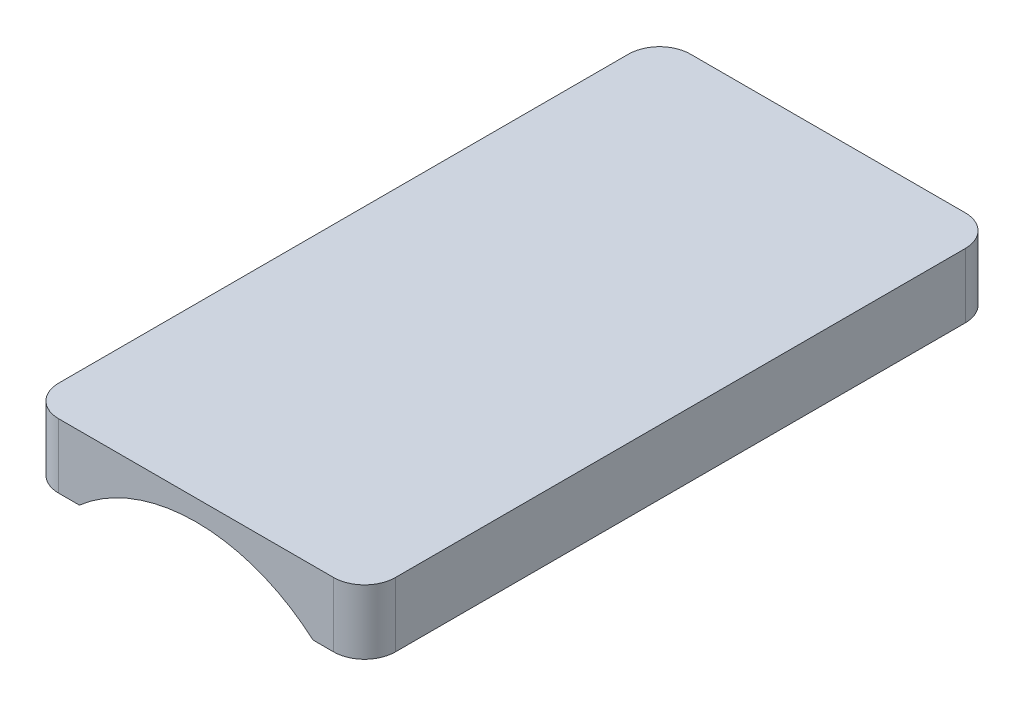
ISO-10303-21;
HEADER;
FILE_DESCRIPTION(('STEP AP214'),'2;1');
FILE_NAME('part.step','',(''),(''),'','','');
FILE_SCHEMA(('AUTOMOTIVE_DESIGN { 1 0 10303 214 1 1 1 1 }'));
ENDSEC;
DATA;
#1=APPLICATION_CONTEXT('core data for automotive mechanical design processes');
#2=APPLICATION_PROTOCOL_DEFINITION('international standard','automotive_design',2000,#1);
#3=PRODUCT_CONTEXT('',#1,'mechanical');
#4=PRODUCT('Part','Part','',(#3));
#5=PRODUCT_RELATED_PRODUCT_CATEGORY('part','',(#4));
#6=PRODUCT_DEFINITION_FORMATION('','',#4);
#7=PRODUCT_DEFINITION_CONTEXT('part definition',#1,'design');
#8=PRODUCT_DEFINITION('design','',#6,#7);
#9=PRODUCT_DEFINITION_SHAPE('','',#8);
#10=(LENGTH_UNIT() NAMED_UNIT(*) SI_UNIT(.MILLI.,.METRE.));
#11=(NAMED_UNIT(*) PLANE_ANGLE_UNIT() SI_UNIT($,.RADIAN.));
#12=(NAMED_UNIT(*) SI_UNIT($,.STERADIAN.) SOLID_ANGLE_UNIT());
#13=UNCERTAINTY_MEASURE_WITH_UNIT(LENGTH_MEASURE(1.E-05),#10,'distance_accuracy_value','');
#14=(GEOMETRIC_REPRESENTATION_CONTEXT(3) GLOBAL_UNCERTAINTY_ASSIGNED_CONTEXT((#13)) GLOBAL_UNIT_ASSIGNED_CONTEXT((#10,
#11,#12)) REPRESENTATION_CONTEXT('',''));
#15=CARTESIAN_POINT('',(0.,0.,0.));
#16=DIRECTION('',(0.,0.,1.));
#17=DIRECTION('',(1.,0.,0.));
#18=AXIS2_PLACEMENT_3D('',#15,#16,#17);
#19=CARTESIAN_POINT('',(32.65,0.,-61.25));
#20=DIRECTION('',(0.,1.,0.));
#21=DIRECTION('',(0.,0.,1.));
#22=AXIS2_PLACEMENT_3D('',#19,#20,#21);
#23=PLANE('',#22);
#24=DIRECTION('',(-1.,0.,0.));
#25=VECTOR('',#24,1.);
#26=CARTESIAN_POINT('',(32.65,0.,0.));
#27=LINE('',#26,#25);
#28=CARTESIAN_POINT('',(5.,0.,0.));
#29=VERTEX_POINT('',#28);
#30=CARTESIAN_POINT('',(3.,0.,0.));
#31=VERTEX_POINT('',#30);
#32=EDGE_CURVE('E211',#29,#31,#27,.T.);
#33=ORIENTED_EDGE('',*,*,#32,.T.);
#34=CARTESIAN_POINT('',(3.,0.,-3.));
#35=DIRECTION('',(0.,1.,0.));
#36=DIRECTION('',(0.,0.,1.));
#37=AXIS2_PLACEMENT_3D('',#34,#35,#36);
#38=CIRCLE('',#37,3.);
#39=CARTESIAN_POINT('',(0.,0.,-3.));
#40=VERTEX_POINT('',#39);
#41=EDGE_CURVE('E241',#31,#40,#38,.F.);
#42=ORIENTED_EDGE('',*,*,#41,.T.);
#43=DIRECTION('',(0.,0.,-1.));
#44=VECTOR('',#43,1.);
#45=CARTESIAN_POINT('',(0.,0.,-61.25));
#46=LINE('',#45,#44);
#47=CARTESIAN_POINT('',(0.,0.,-58.25));
#48=VERTEX_POINT('',#47);
#49=EDGE_CURVE('E203',#40,#48,#46,.T.);
#50=ORIENTED_EDGE('',*,*,#49,.T.);
#51=CARTESIAN_POINT('',(3.,0.,-58.25));
#52=DIRECTION('',(0.,1.,0.));
#53=DIRECTION('',(0.,0.,1.));
#54=AXIS2_PLACEMENT_3D('',#51,#52,#53);
#55=CIRCLE('',#54,3.);
#56=CARTESIAN_POINT('',(3.,0.,-61.25));
#57=VERTEX_POINT('',#56);
#58=EDGE_CURVE('E235',#48,#57,#55,.F.);
#59=ORIENTED_EDGE('',*,*,#58,.T.);
#60=DIRECTION('',(-1.,0.,0.));
#61=VECTOR('',#60,1.);
#62=CARTESIAN_POINT('',(32.65,0.,-61.25));
#63=LINE('',#62,#61);
#64=CARTESIAN_POINT('',(29.65,0.,-61.25));
#65=VERTEX_POINT('',#64);
#66=EDGE_CURVE('E224',#65,#57,#63,.T.);
#67=ORIENTED_EDGE('',*,*,#66,.F.);
#68=CARTESIAN_POINT('',(29.65,0.,-58.25));
#69=DIRECTION('',(0.,1.,0.));
#70=DIRECTION('',(0.,0.,1.));
#71=AXIS2_PLACEMENT_3D('',#68,#69,#70);
#72=CIRCLE('',#71,3.);
#73=CARTESIAN_POINT('',(32.65,0.,-58.25));
#74=VERTEX_POINT('',#73);
#75=EDGE_CURVE('E237',#65,#74,#72,.F.);
#76=ORIENTED_EDGE('',*,*,#75,.T.);
#77=DIRECTION('',(0.,0.,-1.));
#78=VECTOR('',#77,1.);
#79=CARTESIAN_POINT('',(32.65,0.,-61.25));
#80=LINE('',#79,#78);
#81=CARTESIAN_POINT('',(32.65,0.,-3.));
#82=VERTEX_POINT('',#81);
#83=EDGE_CURVE('E204',#82,#74,#80,.T.);
#84=ORIENTED_EDGE('',*,*,#83,.F.);
#85=CARTESIAN_POINT('',(29.65,0.,-3.));
#86=DIRECTION('',(0.,1.,0.));
#87=DIRECTION('',(0.,0.,1.));
#88=AXIS2_PLACEMENT_3D('',#85,#86,#87);
#89=CIRCLE('',#88,3.);
#90=CARTESIAN_POINT('',(29.65,0.,0.));
#91=VERTEX_POINT('',#90);
#92=EDGE_CURVE('E239',#82,#91,#89,.F.);
#93=ORIENTED_EDGE('',*,*,#92,.T.);
#94=CARTESIAN_POINT('',(27.65,0.,0.));
#95=VERTEX_POINT('',#94);
#96=EDGE_CURVE('E218',#91,#95,#27,.T.);
#97=ORIENTED_EDGE('',*,*,#96,.T.);
#98=DIRECTION('',(0.,0.,1.));
#99=VECTOR('',#98,1.);
#100=CARTESIAN_POINT('',(27.65,0.,-35.));
#101=LINE('',#100,#99);
#102=CARTESIAN_POINT('',(27.65,0.,-35.));
#103=VERTEX_POINT('',#102);
#104=EDGE_CURVE('E200',#103,#95,#101,.T.);
#105=ORIENTED_EDGE('',*,*,#104,.F.);
#106=DIRECTION('',(1.,0.,0.));
#107=VECTOR('',#106,1.);
#108=CARTESIAN_POINT('',(5.,0.,-35.));
#109=LINE('',#108,#107);
#110=CARTESIAN_POINT('',(5.,0.,-35.));
#111=VERTEX_POINT('',#110);
#112=EDGE_CURVE('E194',#111,#103,#109,.T.);
#113=ORIENTED_EDGE('',*,*,#112,.F.);
#114=DIRECTION('',(0.,0.,1.));
#115=VECTOR('',#114,1.);
#116=CARTESIAN_POINT('',(5.,0.,-35.));
#117=LINE('',#116,#115);
#118=EDGE_CURVE('E197',#111,#29,#117,.T.);
#119=ORIENTED_EDGE('',*,*,#118,.T.);
#120=EDGE_LOOP('',(#33,#42,#50,#59,#67,#76,#84,#93,#97,#105,#113,#119));
#121=FACE_BOUND('',#120,.T.);
#122=ADVANCED_FACE('F33',(#121),#23,.F.);
#123=CARTESIAN_POINT('',(32.65,6.25,-61.25));
#124=DIRECTION('',(0.,0.,1.));
#125=DIRECTION('',(1.,0.,0.));
#126=AXIS2_PLACEMENT_3D('',#123,#124,#125);
#127=PLANE('',#126);
#128=DIRECTION('',(0.,1.,0.));
#129=VECTOR('',#128,1.);
#130=CARTESIAN_POINT('',(11.175,0.95,-61.25));
#131=LINE('',#130,#129);
#132=CARTESIAN_POINT('',(11.175,0.95,-61.25));
#133=VERTEX_POINT('',#132);
#134=CARTESIAN_POINT('',(11.175,5.3,-61.25));
#135=VERTEX_POINT('',#134);
#136=EDGE_CURVE('E177',#133,#135,#131,.T.);
#137=ORIENTED_EDGE('',*,*,#136,.F.);
#138=DIRECTION('',(-1.,0.,0.));
#139=VECTOR('',#138,1.);
#140=CARTESIAN_POINT('',(21.475,0.95,-61.25));
#141=LINE('',#140,#139);
#142=CARTESIAN_POINT('',(21.475,0.95,-61.25));
#143=VERTEX_POINT('',#142);
#144=EDGE_CURVE('E148',#143,#133,#141,.T.);
#145=ORIENTED_EDGE('',*,*,#144,.F.);
#146=DIRECTION('',(0.707106781186547,-0.707106781186548,0.));
#147=VECTOR('',#146,1.);
#148=CARTESIAN_POINT('',(21.475,0.95,-61.25));
#149=LINE('',#148,#147);
#150=CARTESIAN_POINT('',(19.3,3.125,-61.25));
#151=VERTEX_POINT('',#150);
#152=EDGE_CURVE('E166',#151,#143,#149,.T.);
#153=ORIENTED_EDGE('',*,*,#152,.F.);
#154=DIRECTION('',(-0.707106781186547,-0.707106781186547,0.));
#155=VECTOR('',#154,1.);
#156=CARTESIAN_POINT('',(19.3,3.125,-61.25));
#157=LINE('',#156,#155);
#158=CARTESIAN_POINT('',(21.475,5.3,-61.25));
#159=VERTEX_POINT('',#158);
#160=EDGE_CURVE('E169',#159,#151,#157,.T.);
#161=ORIENTED_EDGE('',*,*,#160,.F.);
#162=DIRECTION('',(1.,0.,0.));
#163=VECTOR('',#162,1.);
#164=CARTESIAN_POINT('',(11.175,5.3,-61.25));
#165=LINE('',#164,#163);
#166=EDGE_CURVE('E179',#135,#159,#165,.T.);
#167=ORIENTED_EDGE('',*,*,#166,.F.);
#168=EDGE_LOOP('',(#137,#145,#153,#161,#167));
#169=FACE_BOUND('',#168,.T.);
#170=DIRECTION('',(-1.,0.,0.));
#171=VECTOR('',#170,1.);
#172=CARTESIAN_POINT('',(32.65,6.25,-61.25));
#173=LINE('',#172,#171);
#174=CARTESIAN_POINT('',(29.65,6.25,-61.25));
#175=VERTEX_POINT('',#174);
#176=CARTESIAN_POINT('',(3.,6.25,-61.25));
#177=VERTEX_POINT('',#176);
#178=EDGE_CURVE('E222',#175,#177,#173,.T.);
#179=ORIENTED_EDGE('',*,*,#178,.F.);
#180=DIRECTION('',(0.,1.,0.));
#181=VECTOR('',#180,1.);
#182=CARTESIAN_POINT('',(29.65,6.25,-61.25));
#183=LINE('',#182,#181);
#184=EDGE_CURVE('E11',#175,#65,#183,.F.);
#185=ORIENTED_EDGE('',*,*,#184,.T.);
#186=ORIENTED_EDGE('',*,*,#66,.T.);
#187=DIRECTION('',(0.,1.,0.));
#188=VECTOR('',#187,1.);
#189=CARTESIAN_POINT('',(3.,6.25,-61.25));
#190=LINE('',#189,#188);
#191=EDGE_CURVE('E41',#57,#177,#190,.T.);
#192=ORIENTED_EDGE('',*,*,#191,.T.);
#193=EDGE_LOOP('',(#179,#185,#186,#192));
#194=FACE_BOUND('',#193,.T.);
#195=ADVANCED_FACE('F259',(#169,#194),#127,.F.);
#196=CARTESIAN_POINT('',(32.65,6.25,0.));
#197=DIRECTION('',(0.,-1.,0.));
#198=DIRECTION('',(0.,0.,-1.));
#199=AXIS2_PLACEMENT_3D('',#196,#197,#198);
#200=PLANE('',#199);
#201=DIRECTION('',(0.,0.,1.));
#202=VECTOR('',#201,1.);
#203=CARTESIAN_POINT('',(0.,6.25,0.));
#204=LINE('',#203,#202);
#205=CARTESIAN_POINT('',(0.,6.25,-58.25));
#206=VERTEX_POINT('',#205);
#207=CARTESIAN_POINT('',(0.,6.25,-3.));
#208=VERTEX_POINT('',#207);
#209=EDGE_CURVE('E208',#206,#208,#204,.T.);
#210=ORIENTED_EDGE('',*,*,#209,.T.);
#211=CARTESIAN_POINT('',(3.,6.25,-3.));
#212=DIRECTION('',(0.,-1.,0.));
#213=DIRECTION('',(0.,0.,-1.));
#214=AXIS2_PLACEMENT_3D('',#211,#212,#213);
#215=CIRCLE('',#214,3.);
#216=CARTESIAN_POINT('',(3.,6.25,0.));
#217=VERTEX_POINT('',#216);
#218=EDGE_CURVE('E251',#208,#217,#215,.F.);
#219=ORIENTED_EDGE('',*,*,#218,.T.);
#220=DIRECTION('',(-1.,0.,0.));
#221=VECTOR('',#220,1.);
#222=CARTESIAN_POINT('',(32.65,6.25,0.));
#223=LINE('',#222,#221);
#224=CARTESIAN_POINT('',(29.65,6.25,0.));
#225=VERTEX_POINT('',#224);
#226=EDGE_CURVE('E219',#225,#217,#223,.T.);
#227=ORIENTED_EDGE('',*,*,#226,.F.);
#228=CARTESIAN_POINT('',(29.65,6.25,-3.));
#229=DIRECTION('',(0.,-1.,0.));
#230=DIRECTION('',(0.,0.,-1.));
#231=AXIS2_PLACEMENT_3D('',#228,#229,#230);
#232=CIRCLE('',#231,3.);
#233=CARTESIAN_POINT('',(32.65,6.25,-3.));
#234=VERTEX_POINT('',#233);
#235=EDGE_CURVE('E249',#225,#234,#232,.F.);
#236=ORIENTED_EDGE('',*,*,#235,.T.);
#237=DIRECTION('',(0.,0.,1.));
#238=VECTOR('',#237,1.);
#239=CARTESIAN_POINT('',(32.65,6.25,0.));
#240=LINE('',#239,#238);
#241=CARTESIAN_POINT('',(32.65,6.25,-58.25));
#242=VERTEX_POINT('',#241);
#243=EDGE_CURVE('E207',#242,#234,#240,.T.);
#244=ORIENTED_EDGE('',*,*,#243,.F.);
#245=CARTESIAN_POINT('',(29.65,6.25,-58.25));
#246=DIRECTION('',(0.,-1.,0.));
#247=DIRECTION('',(0.,0.,-1.));
#248=AXIS2_PLACEMENT_3D('',#245,#246,#247);
#249=CIRCLE('',#248,3.);
#250=EDGE_CURVE('E56',#242,#175,#249,.F.);
#251=ORIENTED_EDGE('',*,*,#250,.T.);
#252=ORIENTED_EDGE('',*,*,#178,.T.);
#253=CARTESIAN_POINT('',(3.,6.25,-58.25));
#254=DIRECTION('',(0.,-1.,0.));
#255=DIRECTION('',(0.,0.,-1.));
#256=AXIS2_PLACEMENT_3D('',#253,#254,#255);
#257=CIRCLE('',#256,3.);
#258=EDGE_CURVE('E48',#177,#206,#257,.F.);
#259=ORIENTED_EDGE('',*,*,#258,.T.);
#260=EDGE_LOOP('',(#210,#219,#227,#236,#244,#251,#252,#259));
#261=FACE_BOUND('',#260,.T.);
#262=ADVANCED_FACE('F263',(#261),#200,.F.);
#263=CARTESIAN_POINT('',(32.65,0.,0.));
#264=DIRECTION('',(0.,0.,-1.));
#265=DIRECTION('',(-1.,0.,0.));
#266=AXIS2_PLACEMENT_3D('',#263,#264,#265);
#267=PLANE('',#266);
#268=ORIENTED_EDGE('',*,*,#226,.T.);
#269=DIRECTION('',(0.,-1.,0.));
#270=VECTOR('',#269,1.);
#271=CARTESIAN_POINT('',(3.,0.,0.));
#272=LINE('',#271,#270);
#273=EDGE_CURVE('E232',#217,#31,#272,.T.);
#274=ORIENTED_EDGE('',*,*,#273,.T.);
#275=ORIENTED_EDGE('',*,*,#32,.F.);
#276=CARTESIAN_POINT('',(16.325,-12.9638970588235,0.));
#277=DIRECTION('',(0.,0.,1.));
#278=DIRECTION('',(1.,0.,0.));
#279=AXIS2_PLACEMENT_3D('',#276,#277,#278);
#280=CIRCLE('',#279,17.2138970588235);
#281=EDGE_CURVE('E227',#29,#95,#280,.F.);
#282=ORIENTED_EDGE('',*,*,#281,.T.);
#283=ORIENTED_EDGE('',*,*,#96,.F.);
#284=DIRECTION('',(0.,-1.,0.));
#285=VECTOR('',#284,1.);
#286=CARTESIAN_POINT('',(29.65,0.,0.));
#287=LINE('',#286,#285);
#288=EDGE_CURVE('E230',#91,#225,#287,.F.);
#289=ORIENTED_EDGE('',*,*,#288,.T.);
#290=EDGE_LOOP('',(#268,#274,#275,#282,#283,#289));
#291=FACE_BOUND('',#290,.T.);
#292=ADVANCED_FACE('F278',(#291),#267,.F.);
#293=CARTESIAN_POINT('',(32.65,0.,0.));
#294=DIRECTION('',(-1.,0.,0.));
#295=DIRECTION('',(0.,0.,1.));
#296=AXIS2_PLACEMENT_3D('',#293,#294,#295);
#297=PLANE('',#296);
#298=ORIENTED_EDGE('',*,*,#243,.T.);
#299=DIRECTION('',(0.,-1.,0.));
#300=VECTOR('',#299,1.);
#301=CARTESIAN_POINT('',(32.65,0.,-3.));
#302=LINE('',#301,#300);
#303=EDGE_CURVE('E256',#234,#82,#302,.T.);
#304=ORIENTED_EDGE('',*,*,#303,.T.);
#305=ORIENTED_EDGE('',*,*,#83,.T.);
#306=DIRECTION('',(0.,1.,0.));
#307=VECTOR('',#306,1.);
#308=CARTESIAN_POINT('',(32.65,0.,-58.25));
#309=LINE('',#308,#307);
#310=EDGE_CURVE('E253',#74,#242,#309,.T.);
#311=ORIENTED_EDGE('',*,*,#310,.T.);
#312=EDGE_LOOP('',(#298,#304,#305,#311));
#313=FACE_BOUND('',#312,.T.);
#314=ADVANCED_FACE('F286',(#313),#297,.F.);
#315=CARTESIAN_POINT('',(0.,0.,0.));
#316=DIRECTION('',(-1.,0.,0.));
#317=DIRECTION('',(0.,0.,1.));
#318=AXIS2_PLACEMENT_3D('',#315,#316,#317);
#319=PLANE('',#318);
#320=ORIENTED_EDGE('',*,*,#49,.F.);
#321=DIRECTION('',(0.,-1.,0.));
#322=VECTOR('',#321,1.);
#323=CARTESIAN_POINT('',(0.,6.25,-3.));
#324=LINE('',#323,#322);
#325=EDGE_CURVE('E245',#40,#208,#324,.F.);
#326=ORIENTED_EDGE('',*,*,#325,.T.);
#327=ORIENTED_EDGE('',*,*,#209,.F.);
#328=DIRECTION('',(0.,1.,0.));
#329=VECTOR('',#328,1.);
#330=CARTESIAN_POINT('',(0.,0.,-58.25));
#331=LINE('',#330,#329);
#332=EDGE_CURVE('E243',#206,#48,#331,.F.);
#333=ORIENTED_EDGE('',*,*,#332,.T.);
#334=EDGE_LOOP('',(#320,#326,#327,#333));
#335=FACE_BOUND('',#334,.T.);
#336=ADVANCED_FACE('F268',(#335),#319,.T.);
#337=CARTESIAN_POINT('',(16.325,-12.9638970588235,-35.));
#338=DIRECTION('',(0.,0.,1.));
#339=DIRECTION('',(1.,0.,0.));
#340=AXIS2_PLACEMENT_3D('',#337,#338,#339);
#341=CYLINDRICAL_SURFACE('',#340,17.2138970588235);
#342=ORIENTED_EDGE('',*,*,#118,.F.);
#343=CARTESIAN_POINT('',(16.325,-12.9638970588235,-35.));
#344=DIRECTION('',(0.,0.,1.));
#345=DIRECTION('',(-1.,0.,0.));
#346=AXIS2_PLACEMENT_3D('',#343,#344,#345);
#347=CIRCLE('',#346,17.2138970588235);
#348=EDGE_CURVE('E186',#103,#111,#347,.T.);
#349=ORIENTED_EDGE('',*,*,#348,.F.);
#350=ORIENTED_EDGE('',*,*,#104,.T.);
#351=ORIENTED_EDGE('',*,*,#281,.F.);
#352=EDGE_LOOP('',(#342,#349,#350,#351));
#353=FACE_BOUND('',#352,.T.);
#354=ADVANCED_FACE('F294',(#353),#341,.F.);
#355=CARTESIAN_POINT('',(16.325,-12.9638970588235,-35.));
#356=DIRECTION('',(0.,0.,-1.));
#357=DIRECTION('',(-1.,0.,0.));
#358=AXIS2_PLACEMENT_3D('',#355,#356,#357);
#359=PLANE('',#358);
#360=ORIENTED_EDGE('',*,*,#348,.T.);
#361=ORIENTED_EDGE('',*,*,#112,.T.);
#362=EDGE_LOOP('',(#360,#361));
#363=FACE_BOUND('',#362,.T.);
#364=ADVANCED_FACE('F296',(#363),#359,.F.);
#365=CARTESIAN_POINT('',(21.475,0.95,-51.25));
#366=DIRECTION('',(0.,-1.,0.));
#367=DIRECTION('',(0.,0.,-1.));
#368=AXIS2_PLACEMENT_3D('',#365,#366,#367);
#369=PLANE('',#368);
#370=ORIENTED_EDGE('',*,*,#144,.T.);
#371=DIRECTION('',(0.,0.,-1.));
#372=VECTOR('',#371,1.);
#373=CARTESIAN_POINT('',(11.175,0.95,-51.25));
#374=LINE('',#373,#372);
#375=CARTESIAN_POINT('',(11.175,0.95,-51.25));
#376=VERTEX_POINT('',#375);
#377=EDGE_CURVE('E141',#376,#133,#374,.T.);
#378=ORIENTED_EDGE('',*,*,#377,.F.);
#379=DIRECTION('',(-1.,0.,0.));
#380=VECTOR('',#379,1.);
#381=CARTESIAN_POINT('',(21.475,0.95,-51.25));
#382=LINE('',#381,#380);
#383=CARTESIAN_POINT('',(21.475,0.95,-51.25));
#384=VERTEX_POINT('',#383);
#385=EDGE_CURVE('E145',#384,#376,#382,.T.);
#386=ORIENTED_EDGE('',*,*,#385,.F.);
#387=DIRECTION('',(0.,0.,-1.));
#388=VECTOR('',#387,1.);
#389=CARTESIAN_POINT('',(21.475,0.95,-51.25));
#390=LINE('',#389,#388);
#391=EDGE_CURVE('E184',#384,#143,#390,.T.);
#392=ORIENTED_EDGE('',*,*,#391,.T.);
#393=EDGE_LOOP('',(#370,#378,#386,#392));
#394=FACE_BOUND('',#393,.T.);
#395=ADVANCED_FACE('F143',(#394),#369,.F.);
#396=CARTESIAN_POINT('',(21.475,0.95,-51.25));
#397=DIRECTION('',(0.707106781186548,0.707106781186547,0.));
#398=DIRECTION('',(-0.707106781186547,0.707106781186548,0.));
#399=AXIS2_PLACEMENT_3D('',#396,#397,#398);
#400=PLANE('',#399);
#401=ORIENTED_EDGE('',*,*,#152,.T.);
#402=ORIENTED_EDGE('',*,*,#391,.F.);
#403=DIRECTION('',(0.707106781186547,-0.707106781186548,0.));
#404=VECTOR('',#403,1.);
#405=CARTESIAN_POINT('',(21.475,0.95,-51.25));
#406=LINE('',#405,#404);
#407=CARTESIAN_POINT('',(19.3,3.125,-51.25));
#408=VERTEX_POINT('',#407);
#409=EDGE_CURVE('E153',#408,#384,#406,.T.);
#410=ORIENTED_EDGE('',*,*,#409,.F.);
#411=DIRECTION('',(0.,0.,-1.));
#412=VECTOR('',#411,1.);
#413=CARTESIAN_POINT('',(19.3,3.125,-51.25));
#414=LINE('',#413,#412);
#415=EDGE_CURVE('E187',#408,#151,#414,.T.);
#416=ORIENTED_EDGE('',*,*,#415,.T.);
#417=EDGE_LOOP('',(#401,#402,#410,#416));
#418=FACE_BOUND('',#417,.T.);
#419=ADVANCED_FACE('F303',(#418),#400,.F.);
#420=CARTESIAN_POINT('',(19.3,3.125,-51.25));
#421=DIRECTION('',(0.707106781186548,-0.707106781186548,0.));
#422=DIRECTION('',(0.707106781186548,0.707106781186548,0.));
#423=AXIS2_PLACEMENT_3D('',#420,#421,#422);
#424=PLANE('',#423);
#425=ORIENTED_EDGE('',*,*,#160,.T.);
#426=ORIENTED_EDGE('',*,*,#415,.F.);
#427=DIRECTION('',(-0.707106781186547,-0.707106781186547,0.));
#428=VECTOR('',#427,1.);
#429=CARTESIAN_POINT('',(19.3,3.125,-51.25));
#430=LINE('',#429,#428);
#431=CARTESIAN_POINT('',(21.475,5.3,-51.25));
#432=VERTEX_POINT('',#431);
#433=EDGE_CURVE('E173',#432,#408,#430,.T.);
#434=ORIENTED_EDGE('',*,*,#433,.F.);
#435=DIRECTION('',(0.,0.,-1.));
#436=VECTOR('',#435,1.);
#437=CARTESIAN_POINT('',(21.475,5.3,-51.25));
#438=LINE('',#437,#436);
#439=EDGE_CURVE('E189',#432,#159,#438,.T.);
#440=ORIENTED_EDGE('',*,*,#439,.T.);
#441=EDGE_LOOP('',(#425,#426,#434,#440));
#442=FACE_BOUND('',#441,.T.);
#443=ADVANCED_FACE('F408',(#442),#424,.F.);
#444=CARTESIAN_POINT('',(11.175,5.3,-51.25));
#445=DIRECTION('',(0.,1.,0.));
#446=DIRECTION('',(0.,0.,1.));
#447=AXIS2_PLACEMENT_3D('',#444,#445,#446);
#448=PLANE('',#447);
#449=ORIENTED_EDGE('',*,*,#166,.T.);
#450=ORIENTED_EDGE('',*,*,#439,.F.);
#451=DIRECTION('',(1.,0.,0.));
#452=VECTOR('',#451,1.);
#453=CARTESIAN_POINT('',(11.175,5.3,-51.25));
#454=LINE('',#453,#452);
#455=CARTESIAN_POINT('',(11.175,5.3,-51.25));
#456=VERTEX_POINT('',#455);
#457=EDGE_CURVE('E161',#456,#432,#454,.T.);
#458=ORIENTED_EDGE('',*,*,#457,.F.);
#459=DIRECTION('',(0.,0.,-1.));
#460=VECTOR('',#459,1.);
#461=CARTESIAN_POINT('',(11.175,5.3,-51.25));
#462=LINE('',#461,#460);
#463=EDGE_CURVE('E152',#456,#135,#462,.T.);
#464=ORIENTED_EDGE('',*,*,#463,.T.);
#465=EDGE_LOOP('',(#449,#450,#458,#464));
#466=FACE_BOUND('',#465,.T.);
#467=ADVANCED_FACE('F399',(#466),#448,.F.);
#468=CARTESIAN_POINT('',(11.175,0.95,-51.25));
#469=DIRECTION('',(-1.,0.,0.));
#470=DIRECTION('',(0.,0.,1.));
#471=AXIS2_PLACEMENT_3D('',#468,#469,#470);
#472=PLANE('',#471);
#473=ORIENTED_EDGE('',*,*,#136,.T.);
#474=ORIENTED_EDGE('',*,*,#463,.F.);
#475=DIRECTION('',(0.,1.,0.));
#476=VECTOR('',#475,1.);
#477=CARTESIAN_POINT('',(11.175,0.95,-51.25));
#478=LINE('',#477,#476);
#479=EDGE_CURVE('E156',#376,#456,#478,.T.);
#480=ORIENTED_EDGE('',*,*,#479,.F.);
#481=ORIENTED_EDGE('',*,*,#377,.T.);
#482=EDGE_LOOP('',(#473,#474,#480,#481));
#483=FACE_BOUND('',#482,.T.);
#484=ADVANCED_FACE('F157',(#483),#472,.F.);
#485=CARTESIAN_POINT('',(0.,0.,-51.25));
#486=DIRECTION('',(0.,0.,-1.));
#487=DIRECTION('',(-1.,0.,0.));
#488=AXIS2_PLACEMENT_3D('',#485,#486,#487);
#489=PLANE('',#488);
#490=ORIENTED_EDGE('',*,*,#385,.T.);
#491=ORIENTED_EDGE('',*,*,#479,.T.);
#492=ORIENTED_EDGE('',*,*,#457,.T.);
#493=ORIENTED_EDGE('',*,*,#433,.T.);
#494=ORIENTED_EDGE('',*,*,#409,.T.);
#495=EDGE_LOOP('',(#490,#491,#492,#493,#494));
#496=FACE_BOUND('',#495,.T.);
#497=ADVANCED_FACE('F163',(#496),#489,.T.);
#498=CARTESIAN_POINT('',(3.,0.,-3.));
#499=DIRECTION('',(0.,1.,0.));
#500=DIRECTION('',(0.,0.,1.));
#501=AXIS2_PLACEMENT_3D('',#498,#499,#500);
#502=CYLINDRICAL_SURFACE('',#501,3.);
#503=ORIENTED_EDGE('',*,*,#218,.F.);
#504=ORIENTED_EDGE('',*,*,#325,.F.);
#505=ORIENTED_EDGE('',*,*,#41,.F.);
#506=ORIENTED_EDGE('',*,*,#273,.F.);
#507=EDGE_LOOP('',(#503,#504,#505,#506));
#508=FACE_BOUND('',#507,.T.);
#509=ADVANCED_FACE('F273',(#508),#502,.T.);
#510=CARTESIAN_POINT('',(29.65,0.,-3.));
#511=DIRECTION('',(0.,-1.,0.));
#512=DIRECTION('',(0.,0.,-1.));
#513=AXIS2_PLACEMENT_3D('',#510,#511,#512);
#514=CYLINDRICAL_SURFACE('',#513,3.);
#515=ORIENTED_EDGE('',*,*,#235,.F.);
#516=ORIENTED_EDGE('',*,*,#288,.F.);
#517=ORIENTED_EDGE('',*,*,#92,.F.);
#518=ORIENTED_EDGE('',*,*,#303,.F.);
#519=EDGE_LOOP('',(#515,#516,#517,#518));
#520=FACE_BOUND('',#519,.T.);
#521=ADVANCED_FACE('F283',(#520),#514,.T.);
#522=CARTESIAN_POINT('',(29.65,0.,-58.25));
#523=DIRECTION('',(0.,1.,0.));
#524=DIRECTION('',(0.,0.,1.));
#525=AXIS2_PLACEMENT_3D('',#522,#523,#524);
#526=CYLINDRICAL_SURFACE('',#525,3.);
#527=ORIENTED_EDGE('',*,*,#75,.F.);
#528=ORIENTED_EDGE('',*,*,#184,.F.);
#529=ORIENTED_EDGE('',*,*,#250,.F.);
#530=ORIENTED_EDGE('',*,*,#310,.F.);
#531=EDGE_LOOP('',(#527,#528,#529,#530));
#532=FACE_BOUND('',#531,.T.);
#533=ADVANCED_FACE('F290',(#532),#526,.T.);
#534=CARTESIAN_POINT('',(3.,6.25,-58.25));
#535=DIRECTION('',(0.,-1.,0.));
#536=DIRECTION('',(0.,0.,-1.));
#537=AXIS2_PLACEMENT_3D('',#534,#535,#536);
#538=CYLINDRICAL_SURFACE('',#537,3.);
#539=ORIENTED_EDGE('',*,*,#58,.F.);
#540=ORIENTED_EDGE('',*,*,#332,.F.);
#541=ORIENTED_EDGE('',*,*,#258,.F.);
#542=ORIENTED_EDGE('',*,*,#191,.F.);
#543=EDGE_LOOP('',(#539,#540,#541,#542));
#544=FACE_BOUND('',#543,.T.);
#545=ADVANCED_FACE('F35',(#544),#538,.T.);
#546=CLOSED_SHELL('',(#122,#195,#262,#292,#314,#336,#354,#364,#395,#419,#443,#467,#484,#497,
#509,#521,#533,#545));
#547=MANIFOLD_SOLID_BREP('B2',#546);
#548=ADVANCED_BREP_SHAPE_REPRESENTATION('',(#18,#547),#14);
#549=SHAPE_DEFINITION_REPRESENTATION(#9,#548);
ENDSEC;
END-ISO-10303-21;
